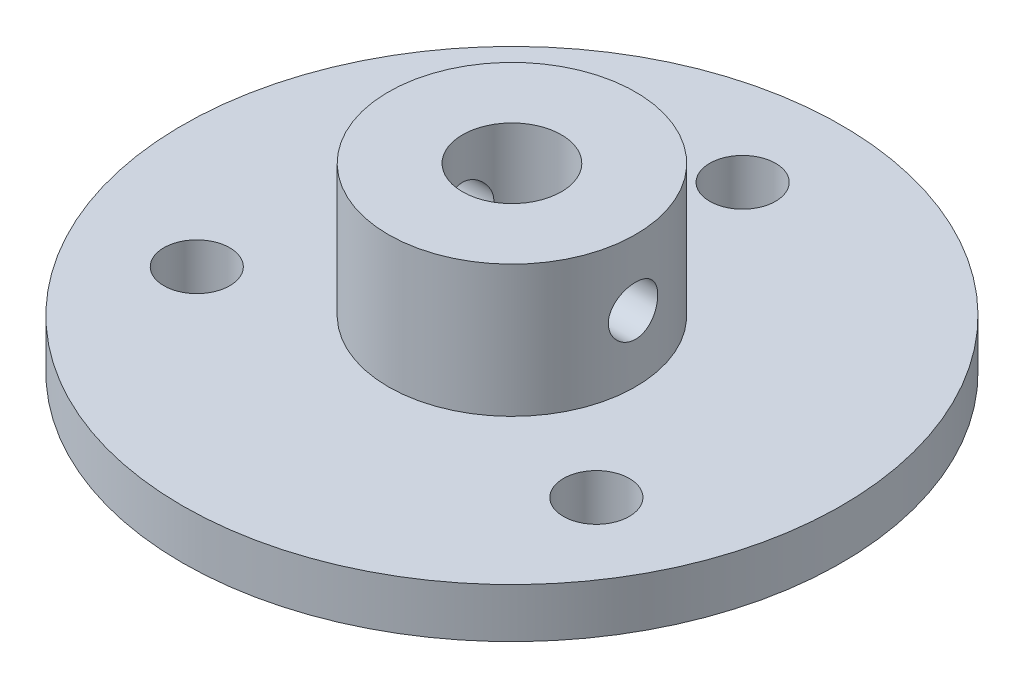
ISO-10303-21;
HEADER;
FILE_DESCRIPTION(('STEP AP214'),'2;1');
FILE_NAME('part.step','',(''),(''),'','','');
FILE_SCHEMA(('AUTOMOTIVE_DESIGN { 1 0 10303 214 1 1 1 1 }'));
ENDSEC;
DATA;
#1=APPLICATION_CONTEXT('core data for automotive mechanical design processes');
#2=APPLICATION_PROTOCOL_DEFINITION('international standard','automotive_design',2000,#1);
#3=PRODUCT_CONTEXT('',#1,'mechanical');
#4=PRODUCT('Part','Part','',(#3));
#5=PRODUCT_RELATED_PRODUCT_CATEGORY('part','',(#4));
#6=PRODUCT_DEFINITION_FORMATION('','',#4);
#7=PRODUCT_DEFINITION_CONTEXT('part definition',#1,'design');
#8=PRODUCT_DEFINITION('design','',#6,#7);
#9=PRODUCT_DEFINITION_SHAPE('','',#8);
#10=(LENGTH_UNIT() NAMED_UNIT(*) SI_UNIT(.MILLI.,.METRE.));
#11=(NAMED_UNIT(*) PLANE_ANGLE_UNIT() SI_UNIT($,.RADIAN.));
#12=(NAMED_UNIT(*) SI_UNIT($,.STERADIAN.) SOLID_ANGLE_UNIT());
#13=UNCERTAINTY_MEASURE_WITH_UNIT(LENGTH_MEASURE(1.E-05),#10,'distance_accuracy_value','');
#14=(GEOMETRIC_REPRESENTATION_CONTEXT(3) GLOBAL_UNCERTAINTY_ASSIGNED_CONTEXT((#13)) GLOBAL_UNIT_ASSIGNED_CONTEXT((#10,
#11,#12)) REPRESENTATION_CONTEXT('',''));
#15=CARTESIAN_POINT('',(0.,0.,0.));
#16=DIRECTION('',(0.,0.,1.));
#17=DIRECTION('',(1.,0.,0.));
#18=AXIS2_PLACEMENT_3D('',#15,#16,#17);
#19=CARTESIAN_POINT('',(0.,3.,0.));
#20=DIRECTION('',(0.,1.,0.));
#21=DIRECTION('',(0.,0.,1.));
#22=AXIS2_PLACEMENT_3D('',#19,#20,#21);
#23=PLANE('',#22);
#24=CARTESIAN_POINT('',(-12.124355652982,3.,7.00000000000015));
#25=DIRECTION('',(0.,1.,0.));
#26=DIRECTION('',(0.,0.,1.));
#27=AXIS2_PLACEMENT_3D('',#24,#25,#26);
#28=CIRCLE('',#27,2.);
#29=CARTESIAN_POINT('',(-12.124355652982,3.,9.00000000000015));
#30=VERTEX_POINT('',#29);
#31=EDGE_CURVE('E130',#30,#30,#28,.T.);
#32=ORIENTED_EDGE('',*,*,#31,.F.);
#33=EDGE_LOOP('',(#32));
#34=FACE_BOUND('',#33,.T.);
#35=CARTESIAN_POINT('',(12.1243556529822,3.,7.00000000000018));
#36=DIRECTION('',(0.,1.,0.));
#37=DIRECTION('',(0.,0.,1.));
#38=AXIS2_PLACEMENT_3D('',#35,#36,#37);
#39=CIRCLE('',#38,2.);
#40=CARTESIAN_POINT('',(12.1243556529822,3.,9.00000000000018));
#41=VERTEX_POINT('',#40);
#42=EDGE_CURVE('E141',#41,#41,#39,.T.);
#43=ORIENTED_EDGE('',*,*,#42,.F.);
#44=EDGE_LOOP('',(#43));
#45=FACE_BOUND('',#44,.T.);
#46=CARTESIAN_POINT('',(0.,3.,0.));
#47=DIRECTION('',(0.,1.,0.));
#48=DIRECTION('',(0.,0.,1.));
#49=AXIS2_PLACEMENT_3D('',#46,#47,#48);
#50=CIRCLE('',#49,20.);
#51=CARTESIAN_POINT('',(0.,3.,20.));
#52=VERTEX_POINT('',#51);
#53=EDGE_CURVE('E10',#52,#52,#50,.T.);
#54=ORIENTED_EDGE('',*,*,#53,.T.);
#55=EDGE_LOOP('',(#54));
#56=FACE_BOUND('',#55,.T.);
#57=CARTESIAN_POINT('',(0.,3.,-14.));
#58=DIRECTION('',(0.,1.,0.));
#59=DIRECTION('',(0.,0.,1.));
#60=AXIS2_PLACEMENT_3D('',#57,#58,#59);
#61=CIRCLE('',#60,2.);
#62=CARTESIAN_POINT('',(0.,3.,-12.));
#63=VERTEX_POINT('',#62);
#64=EDGE_CURVE('E53',#63,#63,#61,.T.);
#65=ORIENTED_EDGE('',*,*,#64,.F.);
#66=EDGE_LOOP('',(#65));
#67=FACE_BOUND('',#66,.T.);
#68=CARTESIAN_POINT('',(0.,3.,0.));
#69=DIRECTION('',(0.,1.,0.));
#70=DIRECTION('',(0.,0.,1.));
#71=AXIS2_PLACEMENT_3D('',#68,#69,#70);
#72=CIRCLE('',#71,7.5);
#73=CARTESIAN_POINT('',(0.,3.,7.5));
#74=VERTEX_POINT('',#73);
#75=EDGE_CURVE('E136',#74,#74,#72,.T.);
#76=ORIENTED_EDGE('',*,*,#75,.F.);
#77=EDGE_LOOP('',(#76));
#78=FACE_BOUND('',#77,.T.);
#79=ADVANCED_FACE('F35',(#34,#45,#56,#67,#78),#23,.T.);
#80=CARTESIAN_POINT('',(0.,0.,0.));
#81=DIRECTION('',(0.,1.,0.));
#82=DIRECTION('',(0.,0.,1.));
#83=AXIS2_PLACEMENT_3D('',#80,#81,#82);
#84=PLANE('',#83);
#85=CARTESIAN_POINT('',(0.,0.,0.));
#86=DIRECTION('',(0.,1.,0.));
#87=DIRECTION('',(0.,0.,1.));
#88=AXIS2_PLACEMENT_3D('',#85,#86,#87);
#89=CIRCLE('',#88,20.);
#90=CARTESIAN_POINT('',(0.,0.,20.));
#91=VERTEX_POINT('',#90);
#92=EDGE_CURVE('E48',#91,#91,#89,.T.);
#93=ORIENTED_EDGE('',*,*,#92,.F.);
#94=EDGE_LOOP('',(#93));
#95=FACE_BOUND('',#94,.T.);
#96=CARTESIAN_POINT('',(0.,0.,-14.));
#97=DIRECTION('',(0.,1.,0.));
#98=DIRECTION('',(0.,0.,1.));
#99=AXIS2_PLACEMENT_3D('',#96,#97,#98);
#100=CIRCLE('',#99,2.);
#101=CARTESIAN_POINT('',(0.,0.,-12.));
#102=VERTEX_POINT('',#101);
#103=EDGE_CURVE('E56',#102,#102,#100,.T.);
#104=ORIENTED_EDGE('',*,*,#103,.T.);
#105=EDGE_LOOP('',(#104));
#106=FACE_BOUND('',#105,.T.);
#107=CARTESIAN_POINT('',(12.1243556529822,0.,7.00000000000018));
#108=DIRECTION('',(0.,1.,0.));
#109=DIRECTION('',(0.,0.,1.));
#110=AXIS2_PLACEMENT_3D('',#107,#108,#109);
#111=CIRCLE('',#110,2.);
#112=CARTESIAN_POINT('',(12.1243556529822,0.,9.00000000000018));
#113=VERTEX_POINT('',#112);
#114=EDGE_CURVE('E121',#113,#113,#111,.T.);
#115=ORIENTED_EDGE('',*,*,#114,.T.);
#116=EDGE_LOOP('',(#115));
#117=FACE_BOUND('',#116,.T.);
#118=CARTESIAN_POINT('',(0.,0.,0.));
#119=DIRECTION('',(0.,1.,0.));
#120=DIRECTION('',(0.,0.,1.));
#121=AXIS2_PLACEMENT_3D('',#118,#119,#120);
#122=CIRCLE('',#121,3.);
#123=CARTESIAN_POINT('',(0.,0.,3.));
#124=VERTEX_POINT('',#123);
#125=EDGE_CURVE('E125',#124,#124,#122,.T.);
#126=ORIENTED_EDGE('',*,*,#125,.T.);
#127=EDGE_LOOP('',(#126));
#128=FACE_BOUND('',#127,.T.);
#129=CARTESIAN_POINT('',(-12.124355652982,0.,7.00000000000015));
#130=DIRECTION('',(0.,1.,0.));
#131=DIRECTION('',(0.,0.,1.));
#132=AXIS2_PLACEMENT_3D('',#129,#130,#131);
#133=CIRCLE('',#132,2.);
#134=CARTESIAN_POINT('',(-12.124355652982,0.,9.00000000000015));
#135=VERTEX_POINT('',#134);
#136=EDGE_CURVE('E128',#135,#135,#133,.T.);
#137=ORIENTED_EDGE('',*,*,#136,.T.);
#138=EDGE_LOOP('',(#137));
#139=FACE_BOUND('',#138,.T.);
#140=ADVANCED_FACE('F105',(#95,#106,#117,#128,#139),#84,.F.);
#141=CARTESIAN_POINT('',(0.,3.,0.));
#142=DIRECTION('',(0.,-1.,0.));
#143=DIRECTION('',(0.,0.,-1.));
#144=AXIS2_PLACEMENT_3D('',#141,#142,#143);
#145=CYLINDRICAL_SURFACE('',#144,20.);
#146=ORIENTED_EDGE('',*,*,#53,.F.);
#147=EDGE_LOOP('',(#146));
#148=FACE_BOUND('',#147,.T.);
#149=ORIENTED_EDGE('',*,*,#92,.T.);
#150=EDGE_LOOP('',(#149));
#151=FACE_BOUND('',#150,.T.);
#152=ADVANCED_FACE('F37',(#148,#151),#145,.T.);
#153=CARTESIAN_POINT('',(0.,3.,-14.));
#154=DIRECTION('',(0.,-1.,0.));
#155=DIRECTION('',(0.,0.,-1.));
#156=AXIS2_PLACEMENT_3D('',#153,#154,#155);
#157=CYLINDRICAL_SURFACE('',#156,2.);
#158=ORIENTED_EDGE('',*,*,#64,.T.);
#159=EDGE_LOOP('',(#158));
#160=FACE_BOUND('',#159,.T.);
#161=ORIENTED_EDGE('',*,*,#103,.F.);
#162=EDGE_LOOP('',(#161));
#163=FACE_BOUND('',#162,.T.);
#164=ADVANCED_FACE('F99',(#160,#163),#157,.F.);
#165=CARTESIAN_POINT('',(12.1243556529822,3.,7.00000000000018));
#166=DIRECTION('',(0.,-1.,0.));
#167=DIRECTION('',(0.,0.,-1.));
#168=AXIS2_PLACEMENT_3D('',#165,#166,#167);
#169=CYLINDRICAL_SURFACE('',#168,2.);
#170=ORIENTED_EDGE('',*,*,#42,.T.);
#171=EDGE_LOOP('',(#170));
#172=FACE_BOUND('',#171,.T.);
#173=ORIENTED_EDGE('',*,*,#114,.F.);
#174=EDGE_LOOP('',(#173));
#175=FACE_BOUND('',#174,.T.);
#176=ADVANCED_FACE('F94',(#172,#175),#169,.F.);
#177=CARTESIAN_POINT('',(0.,3.,0.));
#178=DIRECTION('',(0.,-1.,0.));
#179=DIRECTION('',(0.,0.,-1.));
#180=AXIS2_PLACEMENT_3D('',#177,#178,#179);
#181=CYLINDRICAL_SURFACE('',#180,3.);
#182=CARTESIAN_POINT('',(-2.59807621135332,7.,-1.5));
#183=CARTESIAN_POINT('',(-2.59808302092689,7.07816171229287,-1.4999945446118));
#184=CARTESIAN_POINT('',(-2.60165701781635,7.15642211728757,-1.49384995609983));
#185=CARTESIAN_POINT('',(-2.61543549678079,7.31054089701573,-1.46958481484708));
#186=CARTESIAN_POINT('',(-2.62565391083339,7.38639387256511,-1.45143909683127));
#187=CARTESIAN_POINT('',(-2.65124019908098,7.53317749651591,-1.40414992304972));
#188=CARTESIAN_POINT('',(-2.66658065209878,7.60413197871038,-1.3750649287406));
#189=CARTESIAN_POINT('',(-2.70063997225287,7.74013630299508,-1.30690128806456));
#190=CARTESIAN_POINT('',(-2.71935902214097,7.80518582539368,-1.26782210105366));
#191=CARTESIAN_POINT('',(-2.75995303586162,7.93345859283626,-1.17699981079632));
#192=CARTESIAN_POINT('',(-2.7819609545693,7.99608870351031,-1.12447805421566));
#193=CARTESIAN_POINT('',(-2.82557974178559,8.11211258261006,-1.0098807114217));
#194=CARTESIAN_POINT('',(-2.84719040746875,8.16550174387528,-0.94780038867344));
#195=CARTESIAN_POINT('',(-2.88932215429424,8.26505072672149,-0.81073434512182));
#196=CARTESIAN_POINT('',(-2.90967159627259,8.31048065178929,-0.735160783518862));
#197=CARTESIAN_POINT('',(-2.94526134149294,8.38771127986864,-0.576235539899256));
#198=CARTESIAN_POINT('',(-2.96050486775612,8.41952058420575,-0.492888807207233));
#199=CARTESIAN_POINT('',(-2.98320691866356,8.46625699195165,-0.327067415888967));
#200=CARTESIAN_POINT('',(-2.99114220331338,8.4822242895333,-0.244952685733227));
#201=CARTESIAN_POINT('',(-3.00011375769101,8.50024917801256,-0.078855943046773));
#202=CARTESIAN_POINT('',(-3.00115420176885,8.50231518519356,0.00512490876560692));
#203=CARTESIAN_POINT('',(-2.99644472874675,8.49287998904448,0.164748786635624));
#204=CARTESIAN_POINT('',(-2.99127743838241,8.48254297671817,0.240481798765186));
#205=CARTESIAN_POINT('',(-2.97561367889621,8.45067873414301,0.388970657877482));
#206=CARTESIAN_POINT('',(-2.96511681099591,8.42915066653567,0.461726281640887));
#207=CARTESIAN_POINT('',(-2.93957374931482,8.37537615086528,0.603464087354329));
#208=CARTESIAN_POINT('',(-2.92446662293799,8.3429855302419,0.672380135272766));
#209=CARTESIAN_POINT('',(-2.89106468980031,8.26860487569776,0.803965202269992));
#210=CARTESIAN_POINT('',(-2.87276874236226,8.22661140504647,0.866631973257968));
#211=CARTESIAN_POINT('',(-2.83266591598844,8.12965697270048,0.990260491347291));
#212=CARTESIAN_POINT('',(-2.81069063997263,8.07384545751099,1.05050111254404));
#213=CARTESIAN_POINT('',(-2.76681510880218,7.95311541260474,1.16115655544667));
#214=CARTESIAN_POINT('',(-2.74491492398443,7.88818994158891,1.21156381736134));
#215=CARTESIAN_POINT('',(-2.70216234138727,7.74602771136387,1.30425800196332));
#216=CARTESIAN_POINT('',(-2.68146479986061,7.66827096541869,1.34582597246708));
#217=CARTESIAN_POINT('',(-2.64563175417864,7.5055934929615,1.41497866950185));
#218=CARTESIAN_POINT('',(-2.63049045069101,7.42068035047366,1.44257798731633));
#219=CARTESIAN_POINT('',(-2.60916953725552,7.25317823307581,1.48077031653756));
#220=CARTESIAN_POINT('',(-2.60237483772745,7.17093832143467,1.49253768317996));
#221=CARTESIAN_POINT('',(-2.59676879042414,7.00539798772519,1.50227541991714));
#222=CARTESIAN_POINT('',(-2.59795180333967,6.92209835632032,1.50025553597254));
#223=CARTESIAN_POINT('',(-2.60751504810877,6.76651912213191,1.48355406501595));
#224=CARTESIAN_POINT('',(-2.61509381259981,6.69403082333811,1.4702817250687));
#225=CARTESIAN_POINT('',(-2.63541032327012,6.55244832059356,1.43354442694866));
#226=CARTESIAN_POINT('',(-2.64814974007551,6.48335522388009,1.41007616793542));
#227=CARTESIAN_POINT('',(-2.67804333119485,6.34688300364596,1.35247138290733));
#228=CARTESIAN_POINT('',(-2.69537464864595,6.27973147471967,1.31789109553909));
#229=CARTESIAN_POINT('',(-2.73234179245875,6.15179609269151,1.23943059602371));
#230=CARTESIAN_POINT('',(-2.75197880032721,6.09101553473007,1.19554560649833));
#231=CARTESIAN_POINT('',(-2.79431997684504,5.96953184871468,1.09325575079828));
#232=CARTESIAN_POINT('',(-2.81709874731434,5.90980427392351,1.03371790847245));
#233=CARTESIAN_POINT('',(-2.86101352466839,5.80088164300961,0.905106743097434));
#234=CARTESIAN_POINT('',(-2.88214897511564,5.75169014465419,0.836030211983022));
#235=CARTESIAN_POINT('',(-2.92112042536435,5.66413941107485,0.687803043838137));
#236=CARTESIAN_POINT('',(-2.93885462508044,5.62610032268363,0.608434646361171));
#237=CARTESIAN_POINT('',(-2.96825032438951,5.56429314421391,0.443283546961623));
#238=CARTESIAN_POINT('',(-2.9799171551456,5.54051252295054,0.357506552088264));
#239=CARTESIAN_POINT('',(-2.99501262272824,5.50994715373801,0.190469523495626));
#240=CARTESIAN_POINT('',(-2.99909891862287,5.50180318618583,0.109517165775686));
#241=CARTESIAN_POINT('',(-3.00063195562697,5.4987351018184,-0.052688978926805));
#242=CARTESIAN_POINT('',(-2.99808102100335,5.50380635721465,-0.13394265044263));
#243=CARTESIAN_POINT('',(-2.98700953256884,5.52612461019344,-0.28880698847572));
#244=CARTESIAN_POINT('',(-2.97889342001985,5.54254727388651,-0.362568476716895));
#245=CARTESIAN_POINT('',(-2.95788140495135,5.58599049895446,-0.506168928275426));
#246=CARTESIAN_POINT('',(-2.94498481699194,5.61301258014018,-0.576007327433263));
#247=CARTESIAN_POINT('',(-2.9148889612218,5.67809057824896,-0.713135109367327));
#248=CARTESIAN_POINT('',(-2.89752925798199,5.71656898481176,-0.780187714050069));
#249=CARTESIAN_POINT('',(-2.86032199712739,5.80293689628857,-0.907161962721037));
#250=CARTESIAN_POINT('',(-2.84047329837541,5.85083072367351,-0.96708031112236));
#251=CARTESIAN_POINT('',(-2.79792915339941,5.96019570853405,-1.08437100623534));
#252=CARTESIAN_POINT('',(-2.77514698517547,6.02254373121579,-1.14089652680891));
#253=CARTESIAN_POINT('',(-2.73094614244278,6.15617608169465,-1.24299493109201));
#254=CARTESIAN_POINT('',(-2.70952868642798,6.22746823130152,-1.28855812501509));
#255=CARTESIAN_POINT('',(-2.66999407957374,6.37995496987143,-1.36864661967848));
#256=CARTESIAN_POINT('',(-2.65200261384405,6.4613912966931,-1.40277759894141));
#257=CARTESIAN_POINT('',(-2.62299234492527,6.62999860650967,-1.45631806425962));
#258=CARTESIAN_POINT('',(-2.61195024221553,6.71714933336903,-1.47577678676302));
#259=CARTESIAN_POINT('',(-2.60293908902686,6.83770803347799,-1.49155051179662));
#260=CARTESIAN_POINT('',(-2.60112193507728,6.87005184159682,-1.49471415744578));
#261=CARTESIAN_POINT('',(-2.59868903831625,6.93492472102336,-1.49894010763495));
#262=CARTESIAN_POINT('',(-2.59807337587664,6.96745380457881,-1.50000227159981));
#263=CARTESIAN_POINT('',(-2.59807621135332,7.,-1.5));
#264=B_SPLINE_CURVE_WITH_KNOTS('',3,(#182,#183,#184,#185,#186,#187,#188,#189,#190,#191,#192,
#193,#194,#195,#196,#197,#198,#199,#200,#201,#202,#203,#204,#205,#206,#207,#208,#209,#210,#211,
#212,#213,#214,#215,#216,#217,#218,#219,#220,#221,#222,#223,#224,#225,#226,#227,#228,#229,#230,
#231,#232,#233,#234,#235,#236,#237,#238,#239,#240,#241,#242,#243,#244,#245,#246,#247,#248,#249,
#250,#251,#252,#253,#254,#255,#256,#257,#258,#259,#260,#261,#262,#263),.UNSPECIFIED.,.T.,.F.,(4,
2,2,2,2,2,2,2,2,2,2,2,2,2,2,2,2,2,2,2,2,2,2,2,2,2,2,2,2,2,2,2,2,2,2,2,2,2,2,2,4),(0.,
0.234348183892073,0.469189339237207,0.702792893878328,0.936409088167724,1.18929346874735,
1.44230356626557,1.71236838358145,1.98226240445837,2.23295227451903,2.4834903552906,
2.71224146226808,2.94100968776183,3.1729430209672,3.40495949025408,3.65890787185336,
3.91305072368878,4.18333262594172,4.45333161317557,4.70193436281318,4.9503613978256,
5.17161275136038,5.39293578654095,5.62450944609132,5.85620229330071,6.1171011537092,
6.37808797467303,6.64596272119449,6.91360169713158,7.1566840558423,7.39968130190958,
7.62666637307239,7.8536840026802,8.09041126079208,8.32724745151079,8.58765362775102,
8.84828914267732,9.11716123557908,9.38512699504141,9.48270202777964,9.58028358741811),.UNSPECIFIED.);
#265=CARTESIAN_POINT('',(-2.59807621135332,7.,-1.5));
#266=VERTEX_POINT('',#265);
#267=EDGE_CURVE('E84',#266,#266,#264,.T.);
#268=ORIENTED_EDGE('',*,*,#267,.F.);
#269=EDGE_LOOP('',(#268));
#270=FACE_BOUND('',#269,.T.);
#271=CARTESIAN_POINT('',(2.59807621135332,7.,-1.5));
#272=CARTESIAN_POINT('',(2.59808302092689,6.92183828770712,-1.4999945446118));
#273=CARTESIAN_POINT('',(2.60165701781635,6.84357788271243,-1.49384995609983));
#274=CARTESIAN_POINT('',(2.61543549678079,6.68945910298427,-1.46958481484708));
#275=CARTESIAN_POINT('',(2.62565391083339,6.61360612743489,-1.45143909683127));
#276=CARTESIAN_POINT('',(2.65124019908098,6.46682250348409,-1.40414992304972));
#277=CARTESIAN_POINT('',(2.66658065209878,6.39586802128962,-1.3750649287406));
#278=CARTESIAN_POINT('',(2.70063997225287,6.25986369700492,-1.30690128806456));
#279=CARTESIAN_POINT('',(2.71935902214097,6.19481417460631,-1.26782210105366));
#280=CARTESIAN_POINT('',(2.75995303586162,6.06654140716374,-1.17699981079632));
#281=CARTESIAN_POINT('',(2.7819609545693,6.00391129648968,-1.12447805421566));
#282=CARTESIAN_POINT('',(2.82557974178559,5.88788741738994,-1.0098807114217));
#283=CARTESIAN_POINT('',(2.84719040746875,5.83449825612472,-0.947800388673441));
#284=CARTESIAN_POINT('',(2.88932215429424,5.73494927327851,-0.81073434512182));
#285=CARTESIAN_POINT('',(2.90967159627259,5.6895193482107,-0.735160783518863));
#286=CARTESIAN_POINT('',(2.94526134149293,5.61228872013136,-0.576235539899257));
#287=CARTESIAN_POINT('',(2.96050486775612,5.58047941579424,-0.492888807207234));
#288=CARTESIAN_POINT('',(2.98320691866356,5.53374300804835,-0.327067415888967));
#289=CARTESIAN_POINT('',(2.99114220331338,5.5177757104667,-0.244952685733227));
#290=CARTESIAN_POINT('',(3.00011375769101,5.49975082198744,-0.0788559430467732));
#291=CARTESIAN_POINT('',(3.00115420176885,5.49768481480643,0.00512490876560694));
#292=CARTESIAN_POINT('',(2.99644472874675,5.50712001095552,0.164748786635624));
#293=CARTESIAN_POINT('',(2.99127743838241,5.51745702328183,0.240481798765187));
#294=CARTESIAN_POINT('',(2.97561367889621,5.54932126585698,0.388970657877483));
#295=CARTESIAN_POINT('',(2.96511681099591,5.57084933346433,0.461726281640888));
#296=CARTESIAN_POINT('',(2.93957374931482,5.62462384913472,0.60346408735433));
#297=CARTESIAN_POINT('',(2.92446662293799,5.6570144697581,0.672380135272768));
#298=CARTESIAN_POINT('',(2.89106468980031,5.73139512430224,0.803965202269993));
#299=CARTESIAN_POINT('',(2.87276874236226,5.77338859495352,0.866631973257969));
#300=CARTESIAN_POINT('',(2.83266591598844,5.87034302729952,0.990260491347293));
#301=CARTESIAN_POINT('',(2.81069063997263,5.92615454248901,1.05050111254404));
#302=CARTESIAN_POINT('',(2.76681510880218,6.04688458739526,1.16115655544667));
#303=CARTESIAN_POINT('',(2.74491492398443,6.11181005841109,1.21156381736135));
#304=CARTESIAN_POINT('',(2.70216234138727,6.25397228863613,1.30425800196332));
#305=CARTESIAN_POINT('',(2.68146479986061,6.33172903458132,1.34582597246708));
#306=CARTESIAN_POINT('',(2.64563175417864,6.4944065070385,1.41497866950185));
#307=CARTESIAN_POINT('',(2.63049045069101,6.57931964952634,1.44257798731634));
#308=CARTESIAN_POINT('',(2.60916953725552,6.74682176692419,1.48077031653756));
#309=CARTESIAN_POINT('',(2.60237483772745,6.82906167856533,1.49253768317996));
#310=CARTESIAN_POINT('',(2.59676879042414,6.99460201227481,1.50227541991714));
#311=CARTESIAN_POINT('',(2.59795180333967,7.07790164367968,1.50025553597254));
#312=CARTESIAN_POINT('',(2.60751504810877,7.23348087786809,1.48355406501595));
#313=CARTESIAN_POINT('',(2.61509381259981,7.30596917666189,1.4702817250687));
#314=CARTESIAN_POINT('',(2.63541032327012,7.44755167940644,1.43354442694866));
#315=CARTESIAN_POINT('',(2.64814974007551,7.51664477611991,1.41007616793542));
#316=CARTESIAN_POINT('',(2.67804333119485,7.65311699635404,1.35247138290733));
#317=CARTESIAN_POINT('',(2.69537464864595,7.72026852528033,1.31789109553909));
#318=CARTESIAN_POINT('',(2.73234179245875,7.84820390730849,1.23943059602371));
#319=CARTESIAN_POINT('',(2.75197880032721,7.90898446526993,1.19554560649832));
#320=CARTESIAN_POINT('',(2.79431997684504,8.03046815128532,1.09325575079828));
#321=CARTESIAN_POINT('',(2.81709874731434,8.09019572607649,1.03371790847245));
#322=CARTESIAN_POINT('',(2.86101352466839,8.19911835699039,0.905106743097434));
#323=CARTESIAN_POINT('',(2.88214897511564,8.24830985534581,0.836030211983022));
#324=CARTESIAN_POINT('',(2.92112042536435,8.33586058892515,0.687803043838137));
#325=CARTESIAN_POINT('',(2.93885462508044,8.37389967731636,0.60843464636117));
#326=CARTESIAN_POINT('',(2.96825032438951,8.43570685578609,0.443283546961624));
#327=CARTESIAN_POINT('',(2.9799171551456,8.45948747704946,0.357506552088264));
#328=CARTESIAN_POINT('',(2.99501262272824,8.49005284626199,0.190469523495626));
#329=CARTESIAN_POINT('',(2.99909891862287,8.49819681381417,0.109517165775686));
#330=CARTESIAN_POINT('',(3.00063195562697,8.5012648981816,-0.0526889789268046));
#331=CARTESIAN_POINT('',(2.99808102100335,8.49619364278534,-0.133942650442629));
#332=CARTESIAN_POINT('',(2.98700953256884,8.47387538980656,-0.28880698847572));
#333=CARTESIAN_POINT('',(2.97889342001985,8.45745272611349,-0.362568476716895));
#334=CARTESIAN_POINT('',(2.95788140495135,8.41400950104554,-0.506168928275426));
#335=CARTESIAN_POINT('',(2.94498481699193,8.38698741985982,-0.576007327433263));
#336=CARTESIAN_POINT('',(2.9148889612218,8.32190942175104,-0.713135109367326));
#337=CARTESIAN_POINT('',(2.89752925798199,8.28343101518824,-0.780187714050068));
#338=CARTESIAN_POINT('',(2.86032199712739,8.19706310371143,-0.907161962721036));
#339=CARTESIAN_POINT('',(2.84047329837541,8.14916927632649,-0.96708031112236));
#340=CARTESIAN_POINT('',(2.79792915339941,8.03980429146595,-1.08437100623534));
#341=CARTESIAN_POINT('',(2.77514698517547,7.97745626878421,-1.14089652680891));
#342=CARTESIAN_POINT('',(2.73094614244278,7.84382391830535,-1.24299493109201));
#343=CARTESIAN_POINT('',(2.70952868642798,7.77253176869848,-1.28855812501509));
#344=CARTESIAN_POINT('',(2.66999407957374,7.62004503012857,-1.36864661967848));
#345=CARTESIAN_POINT('',(2.65200261384405,7.5386087033069,-1.40277759894141));
#346=CARTESIAN_POINT('',(2.62299234492527,7.37000139349033,-1.45631806425962));
#347=CARTESIAN_POINT('',(2.61195024221553,7.28285066663097,-1.47577678676302));
#348=CARTESIAN_POINT('',(2.60293908902686,7.16229196652201,-1.49155051179662));
#349=CARTESIAN_POINT('',(2.60112193507728,7.12994815840318,-1.49471415744578));
#350=CARTESIAN_POINT('',(2.59868903831625,7.06507527897663,-1.49894010763495));
#351=CARTESIAN_POINT('',(2.59807337587664,7.03254619542119,-1.50000227159981));
#352=CARTESIAN_POINT('',(2.59807621135332,7.,-1.5));
#353=B_SPLINE_CURVE_WITH_KNOTS('',3,(#271,#272,#273,#274,#275,#276,#277,#278,#279,#280,#281,
#282,#283,#284,#285,#286,#287,#288,#289,#290,#291,#292,#293,#294,#295,#296,#297,#298,#299,#300,
#301,#302,#303,#304,#305,#306,#307,#308,#309,#310,#311,#312,#313,#314,#315,#316,#317,#318,#319,
#320,#321,#322,#323,#324,#325,#326,#327,#328,#329,#330,#331,#332,#333,#334,#335,#336,#337,#338,
#339,#340,#341,#342,#343,#344,#345,#346,#347,#348,#349,#350,#351,#352),.UNSPECIFIED.,.T.,.F.,(4,
2,2,2,2,2,2,2,2,2,2,2,2,2,2,2,2,2,2,2,2,2,2,2,2,2,2,2,2,2,2,2,2,2,2,2,2,2,2,2,4),(0.,
0.234348183892072,0.469189339237207,0.702792893878328,0.936409088167724,1.18929346874735,
1.44230356626556,1.71236838358145,1.98226240445837,2.23295227451903,2.4834903552906,
2.71224146226808,2.94100968776183,3.1729430209672,3.40495949025408,3.65890787185336,
3.91305072368878,4.18333262594173,4.45333161317558,4.70193436281318,4.9503613978256,
5.17161275136038,5.39293578654095,5.62450944609132,5.85620229330071,6.1171011537092,
6.37808797467303,6.64596272119449,6.91360169713157,7.1566840558423,7.39968130190957,
7.62666637307239,7.8536840026802,8.09041126079208,8.32724745151079,8.58765362775101,
8.84828914267731,9.11716123557908,9.38512699504141,9.48270202777964,9.58028358741811),.UNSPECIFIED.);
#354=CARTESIAN_POINT('',(2.59807621135332,7.,-1.5));
#355=VERTEX_POINT('',#354);
#356=EDGE_CURVE('E78',#355,#355,#353,.T.);
#357=ORIENTED_EDGE('',*,*,#356,.F.);
#358=EDGE_LOOP('',(#357));
#359=FACE_BOUND('',#358,.T.);
#360=ORIENTED_EDGE('',*,*,#125,.F.);
#361=EDGE_LOOP('',(#360));
#362=FACE_BOUND('',#361,.T.);
#363=CARTESIAN_POINT('',(0.,11.,0.));
#364=DIRECTION('',(0.,1.,0.));
#365=DIRECTION('',(0.,0.,1.));
#366=AXIS2_PLACEMENT_3D('',#363,#364,#365);
#367=CIRCLE('',#366,3.);
#368=CARTESIAN_POINT('',(0.,11.,3.));
#369=VERTEX_POINT('',#368);
#370=EDGE_CURVE('E152',#369,#369,#367,.T.);
#371=ORIENTED_EDGE('',*,*,#370,.T.);
#372=EDGE_LOOP('',(#371));
#373=FACE_BOUND('',#372,.T.);
#374=ADVANCED_FACE('F89',(#270,#359,#362,#373),#181,.F.);
#375=CARTESIAN_POINT('',(-12.124355652982,3.,7.00000000000015));
#376=DIRECTION('',(0.,-1.,0.));
#377=DIRECTION('',(0.,0.,-1.));
#378=AXIS2_PLACEMENT_3D('',#375,#376,#377);
#379=CYLINDRICAL_SURFACE('',#378,2.);
#380=ORIENTED_EDGE('',*,*,#31,.T.);
#381=EDGE_LOOP('',(#380));
#382=FACE_BOUND('',#381,.T.);
#383=ORIENTED_EDGE('',*,*,#136,.F.);
#384=EDGE_LOOP('',(#383));
#385=FACE_BOUND('',#384,.T.);
#386=ADVANCED_FACE('F93',(#382,#385),#379,.F.);
#387=CARTESIAN_POINT('',(0.,11.,0.));
#388=DIRECTION('',(0.,1.,0.));
#389=DIRECTION('',(0.,0.,1.));
#390=AXIS2_PLACEMENT_3D('',#387,#388,#389);
#391=PLANE('',#390);
#392=CARTESIAN_POINT('',(0.,11.,0.));
#393=DIRECTION('',(0.,1.,0.));
#394=DIRECTION('',(0.,0.,1.));
#395=AXIS2_PLACEMENT_3D('',#392,#393,#394);
#396=CIRCLE('',#395,7.5);
#397=CARTESIAN_POINT('',(0.,11.,7.5));
#398=VERTEX_POINT('',#397);
#399=EDGE_CURVE('E131',#398,#398,#396,.T.);
#400=ORIENTED_EDGE('',*,*,#399,.T.);
#401=EDGE_LOOP('',(#400));
#402=FACE_BOUND('',#401,.T.);
#403=ORIENTED_EDGE('',*,*,#370,.F.);
#404=EDGE_LOOP('',(#403));
#405=FACE_BOUND('',#404,.T.);
#406=ADVANCED_FACE('F72',(#402,#405),#391,.T.);
#407=CARTESIAN_POINT('',(0.,11.,0.));
#408=DIRECTION('',(0.,-1.,0.));
#409=DIRECTION('',(0.,0.,-1.));
#410=AXIS2_PLACEMENT_3D('',#407,#408,#409);
#411=CYLINDRICAL_SURFACE('',#410,7.5);
#412=CARTESIAN_POINT('',(-7.34846922834953,7.,-1.5));
#413=CARTESIAN_POINT('',(-7.34847088538349,7.08334656323576,-1.49999691881235));
#414=CARTESIAN_POINT('',(-7.34990262402618,7.16673193499975,-1.49302975757707));
#415=CARTESIAN_POINT('',(-7.35546646957746,7.33114375771496,-1.46536842537441));
#416=CARTESIAN_POINT('',(-7.35960073717297,7.41216826695404,-1.44466327060578));
#417=CARTESIAN_POINT('',(-7.37008310582665,7.56945595503125,-1.39019367392958));
#418=CARTESIAN_POINT('',(-7.37642900431582,7.64572378229887,-1.35644222122892));
#419=CARTESIAN_POINT('',(-7.39061699221019,7.79151226704545,-1.27687366150577));
#420=CARTESIAN_POINT('',(-7.398458998102,7.86103330080686,-1.23105722790173));
#421=CARTESIAN_POINT('',(-7.4148794954137,7.99234150578078,-1.12796861348015));
#422=CARTESIAN_POINT('',(-7.42346606755867,8.05401938182596,-1.07055848386998));
#423=CARTESIAN_POINT('',(-7.440337084539,8.16693630036847,-0.946210183531967));
#424=CARTESIAN_POINT('',(-7.44862150816248,8.21817461112579,-0.879271345466977));
#425=CARTESIAN_POINT('',(-7.46404194626342,8.30918202644269,-0.737042033886384));
#426=CARTESIAN_POINT('',(-7.47116732162326,8.34884727072496,-0.661683851508316));
#427=CARTESIAN_POINT('',(-7.48337605325447,8.4149124055722,-0.505206225580909));
#428=CARTESIAN_POINT('',(-7.48845960066179,8.44131353785149,-0.424087322130832));
#429=CARTESIAN_POINT('',(-7.49595481032628,8.47976079042944,-0.259525159917744));
#430=CARTESIAN_POINT('',(-7.4984007943219,8.49199146635651,-0.176126608822223));
#431=CARTESIAN_POINT('',(-7.50046381775405,8.50232642775747,-0.00842785265630604));
#432=CARTESIAN_POINT('',(-7.50008112979138,8.50043207446873,0.0758722647477633));
#433=CARTESIAN_POINT('',(-7.49655652302773,8.48271072967667,0.241713001115382));
#434=CARTESIAN_POINT('',(-7.49345397548757,8.46708253424823,0.323275821447704));
#435=CARTESIAN_POINT('',(-7.48488265739113,8.42265245131166,0.482597439870451));
#436=CARTESIAN_POINT('',(-7.47941379216059,8.39385003671219,0.560356085620693));
#437=CARTESIAN_POINT('',(-7.46665944029938,8.3237049397791,0.71042919480133));
#438=CARTESIAN_POINT('',(-7.45936272262835,8.28228437334267,0.782706261200849));
#439=CARTESIAN_POINT('',(-7.44375704210678,8.1881363841451,0.919357568789633));
#440=CARTESIAN_POINT('',(-7.43544796282833,8.13540766034423,0.9837308992875));
#441=CARTESIAN_POINT('',(-7.41856446546689,8.01904956683729,1.10392714658019));
#442=CARTESIAN_POINT('',(-7.40998794686274,7.95524621990562,1.15958147486045));
#443=CARTESIAN_POINT('',(-7.39367357398141,7.81912533632387,1.25942773976521));
#444=CARTESIAN_POINT('',(-7.38593573556822,7.74680763867521,1.30361945959163));
#445=CARTESIAN_POINT('',(-7.37217071209385,7.59546875226729,1.37934422220282));
#446=CARTESIAN_POINT('',(-7.36614722345324,7.51643354854051,1.41084997166656));
#447=CARTESIAN_POINT('',(-7.35654714481909,7.35404301441401,1.46008551244137));
#448=CARTESIAN_POINT('',(-7.35297023592642,7.27068824857137,1.47781709918496));
#449=CARTESIAN_POINT('',(-7.34873218901742,7.10355271300143,1.49874900905408));
#450=CARTESIAN_POINT('',(-7.34802220585731,7.01980363853449,1.50219278834687));
#451=CARTESIAN_POINT('',(-7.34946728533281,6.85292766520047,1.49510644246611));
#452=CARTESIAN_POINT('',(-7.35162218550582,6.7698007313217,1.48457710968366));
#453=CARTESIAN_POINT('',(-7.35850848742372,6.60734703956165,1.45005331211124));
#454=CARTESIAN_POINT('',(-7.36321498521745,6.52799148544635,1.42618893125895));
#455=CARTESIAN_POINT('',(-7.37465234027497,6.37440508145689,1.36581155296278));
#456=CARTESIAN_POINT('',(-7.38138336429404,6.30017465434642,1.32929751355977));
#457=CARTESIAN_POINT('',(-7.39622108943059,6.15788033507476,1.2441062133234));
#458=CARTESIAN_POINT('',(-7.40434457797355,6.08990943054876,1.19527661697413));
#459=CARTESIAN_POINT('',(-7.42100585739955,5.96303753199863,1.08704335831907));
#460=CARTESIAN_POINT('',(-7.42954369085727,5.90413747262612,1.02763860771681));
#461=CARTESIAN_POINT('',(-7.44623018803823,5.79615616122163,0.898848410246836));
#462=CARTESIAN_POINT('',(-7.45437086563026,5.747239518025,0.829323748394445));
#463=CARTESIAN_POINT('',(-7.4692069144293,5.66178117775062,0.682901844952133));
#464=CARTESIAN_POINT('',(-7.47590234632816,5.62523896098283,0.606004913150261));
#465=CARTESIAN_POINT('',(-7.487059410916,5.56580669238005,0.44745402123602));
#466=CARTESIAN_POINT('',(-7.49153368713906,5.54283922266062,0.365830010217117));
#467=CARTESIAN_POINT('',(-7.4977985390649,5.51096312850423,0.199784182019869));
#468=CARTESIAN_POINT('',(-7.49958943799765,5.50205281078647,0.115362703066822));
#469=CARTESIAN_POINT('',(-7.50027810681181,5.49860952855567,-0.0523093408554344));
#470=CARTESIAN_POINT('',(-7.49922567824026,5.50382907931568,-0.135554718212253));
#471=CARTESIAN_POINT('',(-7.49445065340477,5.52795092582172,-0.299956546973462));
#472=CARTESIAN_POINT('',(-7.49072809071528,5.54685304952211,-0.381113024630536));
#473=CARTESIAN_POINT('',(-7.481032475475,5.59769348813746,-0.538879124617643));
#474=CARTESIAN_POINT('',(-7.47506455871866,5.62960206719678,-0.61549866486042));
#475=CARTESIAN_POINT('',(-7.46152083185077,5.70551836199635,-0.762331830278928));
#476=CARTESIAN_POINT('',(-7.45394489468828,5.74952703385557,-0.832544948651117));
#477=CARTESIAN_POINT('',(-7.43786398736791,5.84922908059312,-0.965795835159535));
#478=CARTESIAN_POINT('',(-7.4293460013317,5.90509950458016,-1.02869957417475));
#479=CARTESIAN_POINT('',(-7.41241834355477,6.02657536014365,-1.14432392663527));
#480=CARTESIAN_POINT('',(-7.40400869794476,6.09218309420307,-1.19704212480408));
#481=CARTESIAN_POINT('',(-7.3881501412478,6.2321189750503,-1.29133832918279));
#482=CARTESIAN_POINT('',(-7.38071255446371,6.30653344174069,-1.33279022195961));
#483=CARTESIAN_POINT('',(-7.36777855777287,6.4613991599494,-1.40253607393175));
#484=CARTESIAN_POINT('',(-7.36228038807748,6.54184485804634,-1.43084196896908));
#485=CARTESIAN_POINT('',(-7.3549452169166,6.68539368315525,-1.4680037097813));
#486=CARTESIAN_POINT('',(-7.35253177367824,6.74767812926848,-1.47998084778413));
#487=CARTESIAN_POINT('',(-7.34929317692711,6.87330093182915,-1.49598002694097));
#488=CARTESIAN_POINT('',(-7.34846796865859,6.93663925186744,-1.50000234234439));
#489=CARTESIAN_POINT('',(-7.34846922834953,7.,-1.5));
#490=B_SPLINE_CURVE_WITH_KNOTS('',3,(#412,#413,#414,#415,#416,#417,#418,#419,#420,#421,#422,
#423,#424,#425,#426,#427,#428,#429,#430,#431,#432,#433,#434,#435,#436,#437,#438,#439,#440,#441,
#442,#443,#444,#445,#446,#447,#448,#449,#450,#451,#452,#453,#454,#455,#456,#457,#458,#459,#460,
#461,#462,#463,#464,#465,#466,#467,#468,#469,#470,#471,#472,#473,#474,#475,#476,#477,#478,#479,
#480,#481,#482,#483,#484,#485,#486,#487,#488,#489),.UNSPECIFIED.,.T.,.F.,(4,2,2,2,2,2,2,2,2,2,2,
2,2,2,2,2,2,2,2,2,2,2,2,2,2,2,2,2,2,2,2,2,2,2,2,2,2,2,4),(0.,0.249807695804143,
0.499815358926445,0.749574746910879,0.999320197289796,1.25223378822655,1.50516510053133,
1.76030100656175,2.01541302369839,2.26716373324621,2.51889018174372,2.76703184450306,
3.01518343610625,3.26489886333455,3.51464303655099,3.76874020143725,4.0228421718408,
4.27748794759165,4.53210052524037,4.7823563670689,5.03259801792632,5.28044012674978,
5.52830265531598,5.77939589661782,6.03051499305313,6.28548902600176,6.54045234945157,
6.79394720367975,7.04741152037442,7.29646526122029,7.54551587050135,7.79400025613178,
8.04250428202027,8.29501728038395,8.54759008334672,8.80288347868562,9.057944626334,
9.24785705455344,9.43776293526322),.UNSPECIFIED.);
#491=CARTESIAN_POINT('',(-7.34846922834953,7.,-1.5));
#492=VERTEX_POINT('',#491);
#493=EDGE_CURVE('E39',#492,#492,#490,.T.);
#494=ORIENTED_EDGE('',*,*,#493,.T.);
#495=EDGE_LOOP('',(#494));
#496=FACE_BOUND('',#495,.T.);
#497=CARTESIAN_POINT('',(7.34846922834953,7.,-1.5));
#498=CARTESIAN_POINT('',(7.34847088538349,6.91665343676424,-1.49999691881235));
#499=CARTESIAN_POINT('',(7.34990262402618,6.83326806500025,-1.49302975757707));
#500=CARTESIAN_POINT('',(7.35546646957746,6.66885624228504,-1.46536842537441));
#501=CARTESIAN_POINT('',(7.35960073717297,6.58783173304596,-1.44466327060578));
#502=CARTESIAN_POINT('',(7.37008310582665,6.43054404496875,-1.39019367392958));
#503=CARTESIAN_POINT('',(7.37642900431582,6.35427621770113,-1.35644222122892));
#504=CARTESIAN_POINT('',(7.39061699221019,6.20848773295455,-1.27687366150577));
#505=CARTESIAN_POINT('',(7.398458998102,6.13896669919314,-1.23105722790173));
#506=CARTESIAN_POINT('',(7.4148794954137,6.00765849421921,-1.12796861348015));
#507=CARTESIAN_POINT('',(7.42346606755867,5.94598061817404,-1.07055848386998));
#508=CARTESIAN_POINT('',(7.440337084539,5.83306369963153,-0.946210183531967));
#509=CARTESIAN_POINT('',(7.44862150816248,5.78182538887421,-0.879271345466977));
#510=CARTESIAN_POINT('',(7.46404194626342,5.69081797355731,-0.737042033886384));
#511=CARTESIAN_POINT('',(7.47116732162326,5.65115272927504,-0.661683851508317));
#512=CARTESIAN_POINT('',(7.48337605325447,5.58508759442779,-0.505206225580909));
#513=CARTESIAN_POINT('',(7.48845960066179,5.55868646214851,-0.424087322130831));
#514=CARTESIAN_POINT('',(7.49595481032628,5.52023920957056,-0.259525159917743));
#515=CARTESIAN_POINT('',(7.4984007943219,5.50800853364349,-0.176126608822222));
#516=CARTESIAN_POINT('',(7.50046381775405,5.49767357224253,-0.00842785265630554));
#517=CARTESIAN_POINT('',(7.50008112979138,5.49956792553127,0.0758722647477637));
#518=CARTESIAN_POINT('',(7.49655652302773,5.51728927032333,0.241713001115382));
#519=CARTESIAN_POINT('',(7.49345397548757,5.53291746575177,0.323275821447704));
#520=CARTESIAN_POINT('',(7.48488265739113,5.57734754868834,0.482597439870451));
#521=CARTESIAN_POINT('',(7.47941379216059,5.60614996328781,0.560356085620693));
#522=CARTESIAN_POINT('',(7.46665944029938,5.6762950602209,0.71042919480133));
#523=CARTESIAN_POINT('',(7.45936272262835,5.71771562665733,0.782706261200849));
#524=CARTESIAN_POINT('',(7.44375704210678,5.8118636158549,0.919357568789633));
#525=CARTESIAN_POINT('',(7.43544796282833,5.86459233965577,0.983730899287501));
#526=CARTESIAN_POINT('',(7.41856446546689,5.98095043316271,1.10392714658019));
#527=CARTESIAN_POINT('',(7.40998794686274,6.04475378009438,1.15958147486045));
#528=CARTESIAN_POINT('',(7.39367357398141,6.18087466367613,1.25942773976521));
#529=CARTESIAN_POINT('',(7.38593573556822,6.25319236132479,1.30361945959163));
#530=CARTESIAN_POINT('',(7.37217071209385,6.40453124773271,1.37934422220282));
#531=CARTESIAN_POINT('',(7.36614722345324,6.48356645145949,1.41084997166656));
#532=CARTESIAN_POINT('',(7.35654714481909,6.64595698558599,1.46008551244137));
#533=CARTESIAN_POINT('',(7.35297023592642,6.72931175142862,1.47781709918496));
#534=CARTESIAN_POINT('',(7.34873218901742,6.89644728699857,1.49874900905408));
#535=CARTESIAN_POINT('',(7.34802220585731,6.98019636146551,1.50219278834687));
#536=CARTESIAN_POINT('',(7.34946728533281,7.14707233479952,1.49510644246611));
#537=CARTESIAN_POINT('',(7.35162218550582,7.23019926867829,1.48457710968366));
#538=CARTESIAN_POINT('',(7.35850848742372,7.39265296043835,1.45005331211124));
#539=CARTESIAN_POINT('',(7.36321498521745,7.47200851455364,1.42618893125895));
#540=CARTESIAN_POINT('',(7.37465234027497,7.62559491854311,1.36581155296278));
#541=CARTESIAN_POINT('',(7.38138336429404,7.69982534565358,1.32929751355977));
#542=CARTESIAN_POINT('',(7.39622108943059,7.84211966492524,1.2441062133234));
#543=CARTESIAN_POINT('',(7.40434457797355,7.91009056945124,1.19527661697413));
#544=CARTESIAN_POINT('',(7.42100585739955,8.03696246800137,1.08704335831907));
#545=CARTESIAN_POINT('',(7.42954369085727,8.09586252737388,1.02763860771681));
#546=CARTESIAN_POINT('',(7.44623018803823,8.20384383877836,0.898848410246837));
#547=CARTESIAN_POINT('',(7.45437086563026,8.25276048197499,0.829323748394446));
#548=CARTESIAN_POINT('',(7.4692069144293,8.33821882224938,0.682901844952134));
#549=CARTESIAN_POINT('',(7.47590234632816,8.37476103901717,0.606004913150261));
#550=CARTESIAN_POINT('',(7.487059410916,8.43419330761995,0.44745402123602));
#551=CARTESIAN_POINT('',(7.49153368713906,8.45716077733938,0.365830010217118));
#552=CARTESIAN_POINT('',(7.4977985390649,8.48903687149577,0.19978418201987));
#553=CARTESIAN_POINT('',(7.49958943799765,8.49794718921352,0.115362703066822));
#554=CARTESIAN_POINT('',(7.50027810681181,8.50139047144433,-0.0523093408554344));
#555=CARTESIAN_POINT('',(7.49922567824026,8.49617092068432,-0.135554718212253));
#556=CARTESIAN_POINT('',(7.49445065340477,8.47204907417828,-0.299956546973462));
#557=CARTESIAN_POINT('',(7.49072809071528,8.45314695047789,-0.381113024630536));
#558=CARTESIAN_POINT('',(7.481032475475,8.40230651186253,-0.538879124617644));
#559=CARTESIAN_POINT('',(7.47506455871866,8.37039793280322,-0.61549866486042));
#560=CARTESIAN_POINT('',(7.46152083185077,8.29448163800365,-0.762331830278928));
#561=CARTESIAN_POINT('',(7.45394489468828,8.25047296614443,-0.832544948651117));
#562=CARTESIAN_POINT('',(7.43786398736791,8.15077091940688,-0.965795835159536));
#563=CARTESIAN_POINT('',(7.4293460013317,8.09490049541984,-1.02869957417475));
#564=CARTESIAN_POINT('',(7.41241834355477,7.97342463985635,-1.14432392663527));
#565=CARTESIAN_POINT('',(7.40400869794476,7.90781690579693,-1.19704212480408));
#566=CARTESIAN_POINT('',(7.3881501412478,7.76788102494969,-1.29133832918279));
#567=CARTESIAN_POINT('',(7.38071255446371,7.69346655825931,-1.33279022195961));
#568=CARTESIAN_POINT('',(7.36777855777287,7.5386008400506,-1.40253607393175));
#569=CARTESIAN_POINT('',(7.36228038807748,7.45815514195366,-1.43084196896908));
#570=CARTESIAN_POINT('',(7.3549452169166,7.31460631684475,-1.4680037097813));
#571=CARTESIAN_POINT('',(7.35253177367824,7.25232187073151,-1.47998084778413));
#572=CARTESIAN_POINT('',(7.34929317692711,7.12669906817085,-1.49598002694097));
#573=CARTESIAN_POINT('',(7.34846796865859,7.06336074813256,-1.50000234234439));
#574=CARTESIAN_POINT('',(7.34846922834953,7.,-1.5));
#575=B_SPLINE_CURVE_WITH_KNOTS('',3,(#497,#498,#499,#500,#501,#502,#503,#504,#505,#506,#507,
#508,#509,#510,#511,#512,#513,#514,#515,#516,#517,#518,#519,#520,#521,#522,#523,#524,#525,#526,
#527,#528,#529,#530,#531,#532,#533,#534,#535,#536,#537,#538,#539,#540,#541,#542,#543,#544,#545,
#546,#547,#548,#549,#550,#551,#552,#553,#554,#555,#556,#557,#558,#559,#560,#561,#562,#563,#564,
#565,#566,#567,#568,#569,#570,#571,#572,#573,#574),.UNSPECIFIED.,.T.,.F.,(4,2,2,2,2,2,2,2,2,2,2,
2,2,2,2,2,2,2,2,2,2,2,2,2,2,2,2,2,2,2,2,2,2,2,2,2,2,2,4),(0.,0.249807695804143,
0.499815358926445,0.749574746910878,0.999320197289795,1.25223378822655,1.50516510053133,
1.76030100656175,2.0154130236984,2.26716373324621,2.51889018174372,2.76703184450306,
3.01518343610625,3.26489886333455,3.51464303655099,3.76874020143725,4.0228421718408,
4.27748794759165,4.53210052524037,4.7823563670689,5.03259801792632,5.28044012674978,
5.52830265531598,5.77939589661782,6.03051499305313,6.28548902600176,6.54045234945157,
6.79394720367975,7.04741152037442,7.29646526122029,7.54551587050135,7.79400025613178,
8.04250428202027,8.29501728038396,8.54759008334672,8.80288347868562,9.05794462633399,
9.24785705455344,9.43776293526322),.UNSPECIFIED.);
#576=CARTESIAN_POINT('',(7.34846922834953,7.,-1.5));
#577=VERTEX_POINT('',#576);
#578=EDGE_CURVE('E58',#577,#577,#575,.T.);
#579=ORIENTED_EDGE('',*,*,#578,.T.);
#580=EDGE_LOOP('',(#579));
#581=FACE_BOUND('',#580,.T.);
#582=ORIENTED_EDGE('',*,*,#399,.F.);
#583=EDGE_LOOP('',(#582));
#584=FACE_BOUND('',#583,.T.);
#585=ORIENTED_EDGE('',*,*,#75,.T.);
#586=EDGE_LOOP('',(#585));
#587=FACE_BOUND('',#586,.T.);
#588=ADVANCED_FACE('F63',(#496,#581,#584,#587),#411,.T.);
#589=CARTESIAN_POINT('',(-20.,7.,0.));
#590=DIRECTION('',(1.,0.,0.));
#591=DIRECTION('',(0.,0.,-1.));
#592=AXIS2_PLACEMENT_3D('',#589,#590,#591);
#593=CYLINDRICAL_SURFACE('',#592,1.5);
#594=ORIENTED_EDGE('',*,*,#356,.T.);
#595=EDGE_LOOP('',(#594));
#596=FACE_BOUND('',#595,.T.);
#597=ORIENTED_EDGE('',*,*,#578,.F.);
#598=EDGE_LOOP('',(#597));
#599=FACE_BOUND('',#598,.T.);
#600=ADVANCED_FACE('F70',(#596,#599),#593,.F.);
#601=ORIENTED_EDGE('',*,*,#267,.T.);
#602=EDGE_LOOP('',(#601));
#603=FACE_BOUND('',#602,.T.);
#604=ORIENTED_EDGE('',*,*,#493,.F.);
#605=EDGE_LOOP('',(#604));
#606=FACE_BOUND('',#605,.T.);
#607=ADVANCED_FACE('F67',(#603,#606),#593,.F.);
#608=CLOSED_SHELL('',(#79,#140,#152,#164,#176,#374,#386,#406,#588,#600,#607));
#609=MANIFOLD_SOLID_BREP('B2',#608);
#610=ADVANCED_BREP_SHAPE_REPRESENTATION('',(#18,#609),#14);
#611=SHAPE_DEFINITION_REPRESENTATION(#9,#610);
ENDSEC;
END-ISO-10303-21;
